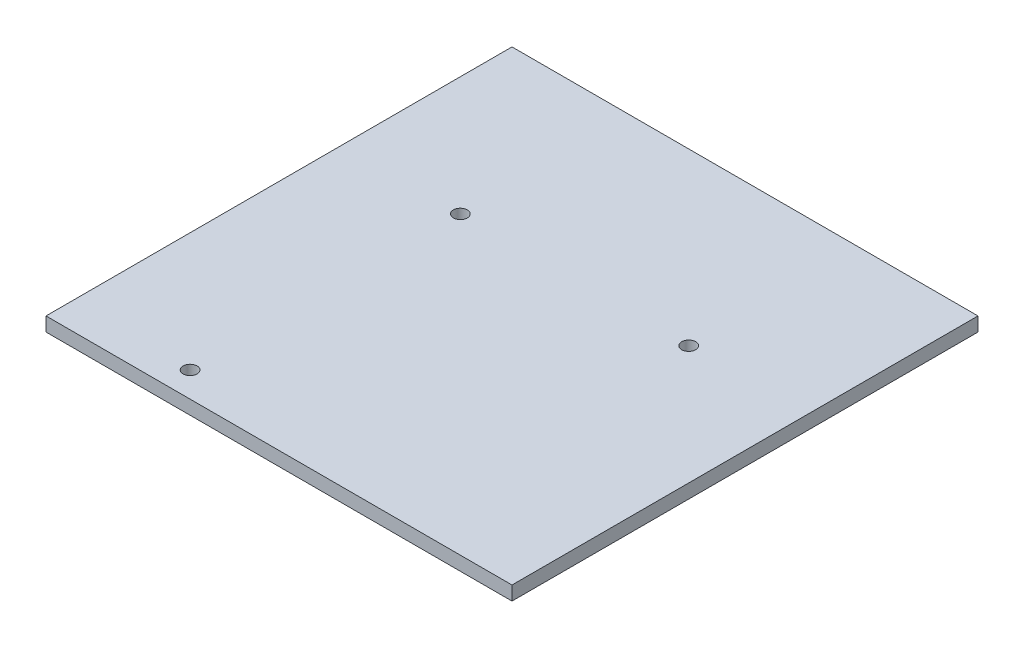
ISO-10303-21;
HEADER;
FILE_DESCRIPTION(('STEP AP214'),'2;1');
FILE_NAME('part.step','',(''),(''),'','','');
FILE_SCHEMA(('AUTOMOTIVE_DESIGN { 1 0 10303 214 1 1 1 1 }'));
ENDSEC;
DATA;
#1=APPLICATION_CONTEXT('core data for automotive mechanical design processes');
#2=APPLICATION_PROTOCOL_DEFINITION('international standard','automotive_design',2000,#1);
#3=PRODUCT_CONTEXT('',#1,'mechanical');
#4=PRODUCT('Part','Part','',(#3));
#5=PRODUCT_RELATED_PRODUCT_CATEGORY('part','',(#4));
#6=PRODUCT_DEFINITION_FORMATION('','',#4);
#7=PRODUCT_DEFINITION_CONTEXT('part definition',#1,'design');
#8=PRODUCT_DEFINITION('design','',#6,#7);
#9=PRODUCT_DEFINITION_SHAPE('','',#8);
#10=(LENGTH_UNIT() NAMED_UNIT(*) SI_UNIT(.MILLI.,.METRE.));
#11=(NAMED_UNIT(*) PLANE_ANGLE_UNIT() SI_UNIT($,.RADIAN.));
#12=(NAMED_UNIT(*) SI_UNIT($,.STERADIAN.) SOLID_ANGLE_UNIT());
#13=UNCERTAINTY_MEASURE_WITH_UNIT(LENGTH_MEASURE(1.E-05),#10,'distance_accuracy_value','');
#14=(GEOMETRIC_REPRESENTATION_CONTEXT(3) GLOBAL_UNCERTAINTY_ASSIGNED_CONTEXT((#13)) GLOBAL_UNIT_ASSIGNED_CONTEXT((#10,
#11,#12)) REPRESENTATION_CONTEXT('',''));
#15=CARTESIAN_POINT('',(0.,0.,0.));
#16=DIRECTION('',(0.,0.,1.));
#17=DIRECTION('',(1.,0.,0.));
#18=AXIS2_PLACEMENT_3D('',#15,#16,#17);
#19=CARTESIAN_POINT('',(0.,3.,0.));
#20=DIRECTION('',(0.,-1.,0.));
#21=DIRECTION('',(0.,0.,-1.));
#22=AXIS2_PLACEMENT_3D('',#19,#20,#21);
#23=PLANE('',#22);
#24=DIRECTION('',(0.,0.,-1.));
#25=VECTOR('',#24,1.);
#26=CARTESIAN_POINT('',(50.,3.,50.));
#27=LINE('',#26,#25);
#28=CARTESIAN_POINT('',(50.,3.,50.));
#29=VERTEX_POINT('',#28);
#30=CARTESIAN_POINT('',(50.,3.,-50.));
#31=VERTEX_POINT('',#30);
#32=EDGE_CURVE('E84',#29,#31,#27,.T.);
#33=ORIENTED_EDGE('',*,*,#32,.T.);
#34=DIRECTION('',(-1.,0.,0.));
#35=VECTOR('',#34,1.);
#36=CARTESIAN_POINT('',(-50.,3.,-50.));
#37=LINE('',#36,#35);
#38=CARTESIAN_POINT('',(-50.,3.,-50.));
#39=VERTEX_POINT('',#38);
#40=EDGE_CURVE('E79',#31,#39,#37,.T.);
#41=ORIENTED_EDGE('',*,*,#40,.T.);
#42=DIRECTION('',(0.,0.,1.));
#43=VECTOR('',#42,1.);
#44=CARTESIAN_POINT('',(-50.,3.,50.));
#45=LINE('',#44,#43);
#46=CARTESIAN_POINT('',(-50.,3.,50.));
#47=VERTEX_POINT('',#46);
#48=EDGE_CURVE('E82',#39,#47,#45,.T.);
#49=ORIENTED_EDGE('',*,*,#48,.T.);
#50=DIRECTION('',(1.,0.,0.));
#51=VECTOR('',#50,1.);
#52=CARTESIAN_POINT('',(-50.,3.,50.));
#53=LINE('',#52,#51);
#54=EDGE_CURVE('E49',#47,#29,#53,.T.);
#55=ORIENTED_EDGE('',*,*,#54,.T.);
#56=EDGE_LOOP('',(#33,#41,#49,#55));
#57=FACE_BOUND('',#56,.T.);
#58=CARTESIAN_POINT('',(-24.5,3.,-13.4228025077272));
#59=DIRECTION('',(0.,1.,0.));
#60=DIRECTION('',(0.,0.,1.));
#61=AXIS2_PLACEMENT_3D('',#58,#59,#60);
#62=CIRCLE('',#61,1.49999999999995);
#63=CARTESIAN_POINT('',(-24.5,3.,-11.9228025077273));
#64=VERTEX_POINT('',#63);
#65=EDGE_CURVE('E99',#64,#64,#62,.T.);
#66=ORIENTED_EDGE('',*,*,#65,.F.);
#67=EDGE_LOOP('',(#66));
#68=FACE_BOUND('',#67,.T.);
#69=CARTESIAN_POINT('',(24.5,3.,-13.4228025077273));
#70=DIRECTION('',(0.,1.,0.));
#71=DIRECTION('',(0.,0.,1.));
#72=AXIS2_PLACEMENT_3D('',#69,#70,#71);
#73=CIRCLE('',#72,1.49999999999989);
#74=CARTESIAN_POINT('',(24.5,3.,-11.9228025077274));
#75=VERTEX_POINT('',#74);
#76=EDGE_CURVE('E114',#75,#75,#73,.T.);
#77=ORIENTED_EDGE('',*,*,#76,.F.);
#78=EDGE_LOOP('',(#77));
#79=FACE_BOUND('',#78,.T.);
#80=CARTESIAN_POINT('',(-24.5,3.,44.5771974922727));
#81=DIRECTION('',(0.,1.,0.));
#82=DIRECTION('',(0.,0.,1.));
#83=AXIS2_PLACEMENT_3D('',#80,#81,#82);
#84=CIRCLE('',#83,1.5);
#85=CARTESIAN_POINT('',(-24.5,3.,46.0771974922727));
#86=VERTEX_POINT('',#85);
#87=EDGE_CURVE('E120',#86,#86,#84,.T.);
#88=ORIENTED_EDGE('',*,*,#87,.F.);
#89=EDGE_LOOP('',(#88));
#90=FACE_BOUND('',#89,.T.);
#91=ADVANCED_FACE('F32',(#57,#68,#79,#90),#23,.F.);
#92=CARTESIAN_POINT('',(0.,0.,0.));
#93=DIRECTION('',(0.,-1.,0.));
#94=DIRECTION('',(0.,0.,-1.));
#95=AXIS2_PLACEMENT_3D('',#92,#93,#94);
#96=PLANE('',#95);
#97=CARTESIAN_POINT('',(24.5,0.,-13.4228025077273));
#98=DIRECTION('',(0.,1.,0.));
#99=DIRECTION('',(0.,0.,1.));
#100=AXIS2_PLACEMENT_3D('',#97,#98,#99);
#101=CIRCLE('',#100,1.49999999999989);
#102=CARTESIAN_POINT('',(24.5,0.,-11.9228025077274));
#103=VERTEX_POINT('',#102);
#104=EDGE_CURVE('E117',#103,#103,#101,.T.);
#105=ORIENTED_EDGE('',*,*,#104,.T.);
#106=EDGE_LOOP('',(#105));
#107=FACE_BOUND('',#106,.T.);
#108=DIRECTION('',(0.,0.,-1.));
#109=VECTOR('',#108,1.);
#110=CARTESIAN_POINT('',(50.,0.,50.));
#111=LINE('',#110,#109);
#112=CARTESIAN_POINT('',(50.,0.,50.));
#113=VERTEX_POINT('',#112);
#114=CARTESIAN_POINT('',(50.,0.,-50.));
#115=VERTEX_POINT('',#114);
#116=EDGE_CURVE('E96',#113,#115,#111,.T.);
#117=ORIENTED_EDGE('',*,*,#116,.F.);
#118=DIRECTION('',(1.,0.,0.));
#119=VECTOR('',#118,1.);
#120=CARTESIAN_POINT('',(-50.,0.,50.));
#121=LINE('',#120,#119);
#122=CARTESIAN_POINT('',(-50.,0.,50.));
#123=VERTEX_POINT('',#122);
#124=EDGE_CURVE('E72',#123,#113,#121,.T.);
#125=ORIENTED_EDGE('',*,*,#124,.F.);
#126=DIRECTION('',(0.,0.,1.));
#127=VECTOR('',#126,1.);
#128=CARTESIAN_POINT('',(-50.,0.,50.));
#129=LINE('',#128,#127);
#130=CARTESIAN_POINT('',(-50.,0.,-50.));
#131=VERTEX_POINT('',#130);
#132=EDGE_CURVE('E66',#131,#123,#129,.T.);
#133=ORIENTED_EDGE('',*,*,#132,.F.);
#134=DIRECTION('',(-1.,0.,0.));
#135=VECTOR('',#134,1.);
#136=CARTESIAN_POINT('',(-50.,0.,-50.));
#137=LINE('',#136,#135);
#138=EDGE_CURVE('E88',#115,#131,#137,.T.);
#139=ORIENTED_EDGE('',*,*,#138,.F.);
#140=EDGE_LOOP('',(#117,#125,#133,#139));
#141=FACE_BOUND('',#140,.T.);
#142=CARTESIAN_POINT('',(-24.5,0.,-13.4228025077272));
#143=DIRECTION('',(0.,1.,0.));
#144=DIRECTION('',(0.,0.,1.));
#145=AXIS2_PLACEMENT_3D('',#142,#143,#144);
#146=CIRCLE('',#145,1.49999999999995);
#147=CARTESIAN_POINT('',(-24.5,0.,-11.9228025077273));
#148=VERTEX_POINT('',#147);
#149=EDGE_CURVE('E111',#148,#148,#146,.T.);
#150=ORIENTED_EDGE('',*,*,#149,.T.);
#151=EDGE_LOOP('',(#150));
#152=FACE_BOUND('',#151,.T.);
#153=CARTESIAN_POINT('',(-24.5,0.,44.5771974922727));
#154=DIRECTION('',(0.,1.,0.));
#155=DIRECTION('',(0.,0.,1.));
#156=AXIS2_PLACEMENT_3D('',#153,#154,#155);
#157=CIRCLE('',#156,1.5);
#158=CARTESIAN_POINT('',(-24.5,0.,46.0771974922727));
#159=VERTEX_POINT('',#158);
#160=EDGE_CURVE('E123',#159,#159,#157,.T.);
#161=ORIENTED_EDGE('',*,*,#160,.T.);
#162=EDGE_LOOP('',(#161));
#163=FACE_BOUND('',#162,.T.);
#164=ADVANCED_FACE('F107',(#107,#141,#152,#163),#96,.T.);
#165=CARTESIAN_POINT('',(50.,3.,50.));
#166=DIRECTION('',(-1.,0.,0.));
#167=DIRECTION('',(0.,0.,1.));
#168=AXIS2_PLACEMENT_3D('',#165,#166,#167);
#169=PLANE('',#168);
#170=ORIENTED_EDGE('',*,*,#116,.T.);
#171=DIRECTION('',(0.,-1.,0.));
#172=VECTOR('',#171,1.);
#173=CARTESIAN_POINT('',(50.,3.,-50.));
#174=LINE('',#173,#172);
#175=EDGE_CURVE('E11',#31,#115,#174,.T.);
#176=ORIENTED_EDGE('',*,*,#175,.F.);
#177=ORIENTED_EDGE('',*,*,#32,.F.);
#178=DIRECTION('',(0.,-1.,0.));
#179=VECTOR('',#178,1.);
#180=CARTESIAN_POINT('',(50.,3.,50.));
#181=LINE('',#180,#179);
#182=EDGE_CURVE('E92',#29,#113,#181,.T.);
#183=ORIENTED_EDGE('',*,*,#182,.T.);
#184=EDGE_LOOP('',(#170,#176,#177,#183));
#185=FACE_BOUND('',#184,.T.);
#186=ADVANCED_FACE('F34',(#185),#169,.F.);
#187=CARTESIAN_POINT('',(-50.,3.,-50.));
#188=DIRECTION('',(0.,0.,1.));
#189=DIRECTION('',(1.,0.,0.));
#190=AXIS2_PLACEMENT_3D('',#187,#188,#189);
#191=PLANE('',#190);
#192=ORIENTED_EDGE('',*,*,#138,.T.);
#193=DIRECTION('',(0.,-1.,0.));
#194=VECTOR('',#193,1.);
#195=CARTESIAN_POINT('',(-50.,3.,-50.));
#196=LINE('',#195,#194);
#197=EDGE_CURVE('E41',#39,#131,#196,.T.);
#198=ORIENTED_EDGE('',*,*,#197,.F.);
#199=ORIENTED_EDGE('',*,*,#40,.F.);
#200=ORIENTED_EDGE('',*,*,#175,.T.);
#201=EDGE_LOOP('',(#192,#198,#199,#200));
#202=FACE_BOUND('',#201,.T.);
#203=ADVANCED_FACE('F87',(#202),#191,.F.);
#204=CARTESIAN_POINT('',(-50.,3.,50.));
#205=DIRECTION('',(1.,0.,0.));
#206=DIRECTION('',(0.,0.,-1.));
#207=AXIS2_PLACEMENT_3D('',#204,#205,#206);
#208=PLANE('',#207);
#209=ORIENTED_EDGE('',*,*,#132,.T.);
#210=DIRECTION('',(0.,-1.,0.));
#211=VECTOR('',#210,1.);
#212=CARTESIAN_POINT('',(-50.,3.,50.));
#213=LINE('',#212,#211);
#214=EDGE_CURVE('E89',#47,#123,#213,.T.);
#215=ORIENTED_EDGE('',*,*,#214,.F.);
#216=ORIENTED_EDGE('',*,*,#48,.F.);
#217=ORIENTED_EDGE('',*,*,#197,.T.);
#218=EDGE_LOOP('',(#209,#215,#216,#217));
#219=FACE_BOUND('',#218,.T.);
#220=ADVANCED_FACE('F90',(#219),#208,.F.);
#221=CARTESIAN_POINT('',(-50.,3.,50.));
#222=DIRECTION('',(0.,0.,-1.));
#223=DIRECTION('',(-1.,0.,0.));
#224=AXIS2_PLACEMENT_3D('',#221,#222,#223);
#225=PLANE('',#224);
#226=ORIENTED_EDGE('',*,*,#124,.T.);
#227=ORIENTED_EDGE('',*,*,#182,.F.);
#228=ORIENTED_EDGE('',*,*,#54,.F.);
#229=ORIENTED_EDGE('',*,*,#214,.T.);
#230=EDGE_LOOP('',(#226,#227,#228,#229));
#231=FACE_BOUND('',#230,.T.);
#232=ADVANCED_FACE('F104',(#231),#225,.F.);
#233=CARTESIAN_POINT('',(-24.5,3.,-13.4228025077272));
#234=DIRECTION('',(0.,-1.,0.));
#235=DIRECTION('',(0.,0.,-1.));
#236=AXIS2_PLACEMENT_3D('',#233,#234,#235);
#237=CYLINDRICAL_SURFACE('',#236,1.49999999999995);
#238=ORIENTED_EDGE('',*,*,#65,.T.);
#239=EDGE_LOOP('',(#238));
#240=FACE_BOUND('',#239,.T.);
#241=ORIENTED_EDGE('',*,*,#149,.F.);
#242=EDGE_LOOP('',(#241));
#243=FACE_BOUND('',#242,.T.);
#244=ADVANCED_FACE('F140',(#240,#243),#237,.F.);
#245=CARTESIAN_POINT('',(24.5,3.,-13.4228025077273));
#246=DIRECTION('',(0.,-1.,0.));
#247=DIRECTION('',(0.,0.,-1.));
#248=AXIS2_PLACEMENT_3D('',#245,#246,#247);
#249=CYLINDRICAL_SURFACE('',#248,1.49999999999989);
#250=ORIENTED_EDGE('',*,*,#76,.T.);
#251=EDGE_LOOP('',(#250));
#252=FACE_BOUND('',#251,.T.);
#253=ORIENTED_EDGE('',*,*,#104,.F.);
#254=EDGE_LOOP('',(#253));
#255=FACE_BOUND('',#254,.T.);
#256=ADVANCED_FACE('F186',(#252,#255),#249,.F.);
#257=CARTESIAN_POINT('',(-24.5,3.,44.5771974922727));
#258=DIRECTION('',(0.,-1.,0.));
#259=DIRECTION('',(0.,0.,-1.));
#260=AXIS2_PLACEMENT_3D('',#257,#258,#259);
#261=CYLINDRICAL_SURFACE('',#260,1.5);
#262=ORIENTED_EDGE('',*,*,#87,.T.);
#263=EDGE_LOOP('',(#262));
#264=FACE_BOUND('',#263,.T.);
#265=ORIENTED_EDGE('',*,*,#160,.F.);
#266=EDGE_LOOP('',(#265));
#267=FACE_BOUND('',#266,.T.);
#268=ADVANCED_FACE('F129',(#264,#267),#261,.F.);
#269=CLOSED_SHELL('',(#91,#164,#186,#203,#220,#232,#244,#256,#268));
#270=MANIFOLD_SOLID_BREP('B2',#269);
#271=ADVANCED_BREP_SHAPE_REPRESENTATION('',(#18,#270),#14);
#272=SHAPE_DEFINITION_REPRESENTATION(#9,#271);
ENDSEC;
END-ISO-10303-21;
